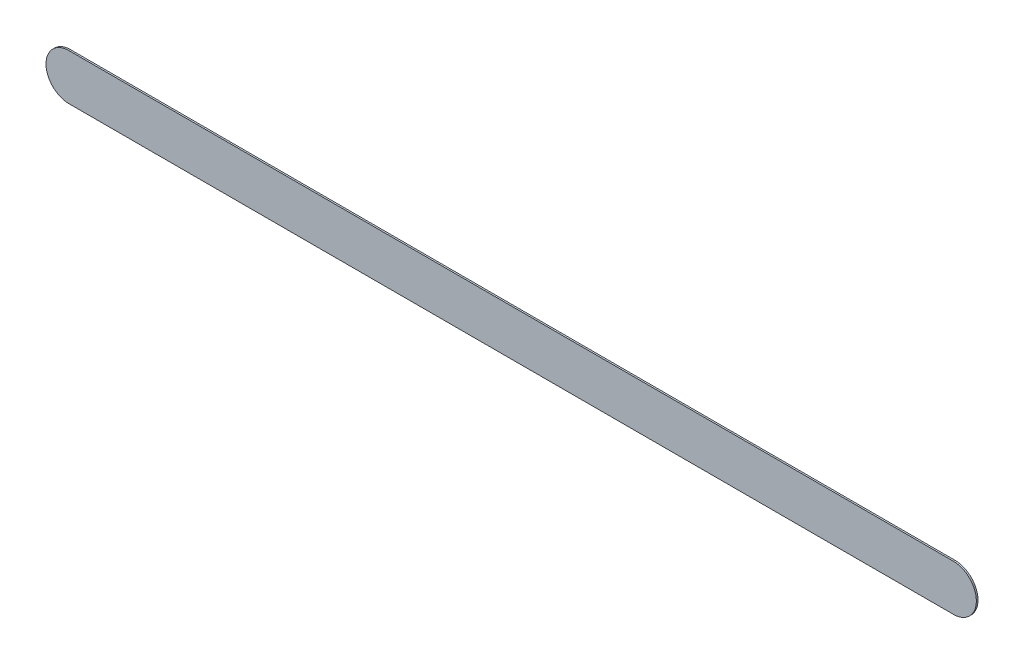
ISO-10303-21;
HEADER;
FILE_DESCRIPTION(('STEP AP214'),'2;1');
FILE_NAME('part.step','',(''),(''),'','','');
FILE_SCHEMA(('AUTOMOTIVE_DESIGN { 1 0 10303 214 1 1 1 1 }'));
ENDSEC;
DATA;
#1=APPLICATION_CONTEXT('core data for automotive mechanical design processes');
#2=APPLICATION_PROTOCOL_DEFINITION('international standard','automotive_design',2000,#1);
#3=PRODUCT_CONTEXT('',#1,'mechanical');
#4=PRODUCT('Part','Part','',(#3));
#5=PRODUCT_RELATED_PRODUCT_CATEGORY('part','',(#4));
#6=PRODUCT_DEFINITION_FORMATION('','',#4);
#7=PRODUCT_DEFINITION_CONTEXT('part definition',#1,'design');
#8=PRODUCT_DEFINITION('design','',#6,#7);
#9=PRODUCT_DEFINITION_SHAPE('','',#8);
#10=(LENGTH_UNIT() NAMED_UNIT(*) SI_UNIT(.MILLI.,.METRE.));
#11=(NAMED_UNIT(*) PLANE_ANGLE_UNIT() SI_UNIT($,.RADIAN.));
#12=(NAMED_UNIT(*) SI_UNIT($,.STERADIAN.) SOLID_ANGLE_UNIT());
#13=UNCERTAINTY_MEASURE_WITH_UNIT(LENGTH_MEASURE(1.E-05),#10,'distance_accuracy_value','');
#14=(GEOMETRIC_REPRESENTATION_CONTEXT(3) GLOBAL_UNCERTAINTY_ASSIGNED_CONTEXT((#13)) GLOBAL_UNIT_ASSIGNED_CONTEXT((#10,
#11,#12)) REPRESENTATION_CONTEXT('',''));
#15=CARTESIAN_POINT('',(0.,0.,0.));
#16=DIRECTION('',(0.,0.,1.));
#17=DIRECTION('',(1.,0.,0.));
#18=AXIS2_PLACEMENT_3D('',#15,#16,#17);
#19=CARTESIAN_POINT('',(91.2229824,48.903001,0.));
#20=DIRECTION('',(0.,1.,0.));
#21=DIRECTION('',(1.,0.,0.));
#22=AXIS2_PLACEMENT_3D('',#19,#20,#21);
#23=PLANE('',#22);
#24=DIRECTION('',(1.,0.,0.));
#25=VECTOR('',#24,1.);
#26=CARTESIAN_POINT('',(91.2229824,48.903001,0.03556));
#27=LINE('',#26,#25);
#28=CARTESIAN_POINT('',(91.2229824,48.903001,0.03556));
#29=VERTEX_POINT('',#28);
#30=CARTESIAN_POINT('',(110.4392,48.903001,0.03556));
#31=VERTEX_POINT('',#30);
#32=EDGE_CURVE('E11',#29,#31,#27,.T.);
#33=ORIENTED_EDGE('',*,*,#32,.F.);
#34=DIRECTION('',(0.,0.,1.));
#35=VECTOR('',#34,1.);
#36=CARTESIAN_POINT('',(91.2229824,48.903001,0.));
#37=LINE('',#36,#35);
#38=CARTESIAN_POINT('',(91.2229824,48.903001,0.));
#39=VERTEX_POINT('',#38);
#40=EDGE_CURVE('E24',#39,#29,#37,.T.);
#41=ORIENTED_EDGE('',*,*,#40,.F.);
#42=DIRECTION('',(1.,0.,0.));
#43=VECTOR('',#42,1.);
#44=CARTESIAN_POINT('',(91.2229824,48.903001,0.));
#45=LINE('',#44,#43);
#46=CARTESIAN_POINT('',(110.4392,48.903001,0.));
#47=VERTEX_POINT('',#46);
#48=EDGE_CURVE('E75',#39,#47,#45,.T.);
#49=ORIENTED_EDGE('',*,*,#48,.T.);
#50=DIRECTION('',(0.,0.,1.));
#51=VECTOR('',#50,1.);
#52=CARTESIAN_POINT('',(110.4392,48.903001,0.));
#53=LINE('',#52,#51);
#54=EDGE_CURVE('E37',#47,#31,#53,.T.);
#55=ORIENTED_EDGE('',*,*,#54,.T.);
#56=EDGE_LOOP('',(#33,#41,#49,#55));
#57=FACE_BOUND('',#56,.T.);
#58=ADVANCED_FACE('F17',(#57),#23,.F.);
#59=CARTESIAN_POINT('',(110.4392,49.403,0.));
#60=DIRECTION('',(0.,0.,-1.));
#61=DIRECTION('',(0.,-1.,0.));
#62=AXIS2_PLACEMENT_3D('',#59,#60,#61);
#63=CYLINDRICAL_SURFACE('',#62,0.499999000000002);
#64=CARTESIAN_POINT('',(110.4392,49.403,0.03556));
#65=DIRECTION('',(0.,0.,1.));
#66=DIRECTION('',(0.,-1.,0.));
#67=AXIS2_PLACEMENT_3D('',#64,#65,#66);
#68=CIRCLE('',#67,0.499999000000002);
#69=CARTESIAN_POINT('',(110.4392,49.902999,0.03556));
#70=VERTEX_POINT('',#69);
#71=EDGE_CURVE('E83',#31,#70,#68,.T.);
#72=ORIENTED_EDGE('',*,*,#71,.F.);
#73=ORIENTED_EDGE('',*,*,#54,.F.);
#74=CARTESIAN_POINT('',(110.4392,49.403,0.));
#75=DIRECTION('',(0.,0.,1.));
#76=DIRECTION('',(0.,-1.,0.));
#77=AXIS2_PLACEMENT_3D('',#74,#75,#76);
#78=CIRCLE('',#77,0.499999000000002);
#79=CARTESIAN_POINT('',(110.4392,49.902999,0.));
#80=VERTEX_POINT('',#79);
#81=EDGE_CURVE('E81',#47,#80,#78,.T.);
#82=ORIENTED_EDGE('',*,*,#81,.T.);
#83=DIRECTION('',(0.,0.,1.));
#84=VECTOR('',#83,1.);
#85=CARTESIAN_POINT('',(110.4392,49.902999,0.));
#86=LINE('',#85,#84);
#87=EDGE_CURVE('E67',#80,#70,#86,.T.);
#88=ORIENTED_EDGE('',*,*,#87,.T.);
#89=EDGE_LOOP('',(#72,#73,#82,#88));
#90=FACE_BOUND('',#89,.T.);
#91=ADVANCED_FACE('F89',(#90),#63,.T.);
#92=CARTESIAN_POINT('',(110.4392,49.902999,0.));
#93=DIRECTION('',(0.,-1.,0.));
#94=DIRECTION('',(-1.,0.,0.));
#95=AXIS2_PLACEMENT_3D('',#92,#93,#94);
#96=PLANE('',#95);
#97=DIRECTION('',(-1.,0.,0.));
#98=VECTOR('',#97,1.);
#99=CARTESIAN_POINT('',(110.4392,49.902999,0.03556));
#100=LINE('',#99,#98);
#101=CARTESIAN_POINT('',(91.2229824,49.902999,0.03556));
#102=VERTEX_POINT('',#101);
#103=EDGE_CURVE('E71',#70,#102,#100,.T.);
#104=ORIENTED_EDGE('',*,*,#103,.F.);
#105=ORIENTED_EDGE('',*,*,#87,.F.);
#106=DIRECTION('',(-1.,0.,0.));
#107=VECTOR('',#106,1.);
#108=CARTESIAN_POINT('',(110.4392,49.902999,0.));
#109=LINE('',#108,#107);
#110=CARTESIAN_POINT('',(91.2229824,49.902999,0.));
#111=VERTEX_POINT('',#110);
#112=EDGE_CURVE('E63',#80,#111,#109,.T.);
#113=ORIENTED_EDGE('',*,*,#112,.T.);
#114=DIRECTION('',(0.,0.,1.));
#115=VECTOR('',#114,1.);
#116=CARTESIAN_POINT('',(91.2229824,49.902999,0.));
#117=LINE('',#116,#115);
#118=EDGE_CURVE('E53',#111,#102,#117,.T.);
#119=ORIENTED_EDGE('',*,*,#118,.T.);
#120=EDGE_LOOP('',(#104,#105,#113,#119));
#121=FACE_BOUND('',#120,.T.);
#122=ADVANCED_FACE('F66',(#121),#96,.F.);
#123=CARTESIAN_POINT('',(91.2229824,49.403,0.));
#124=DIRECTION('',(0.,0.,-1.));
#125=DIRECTION('',(0.,1.,0.));
#126=AXIS2_PLACEMENT_3D('',#123,#124,#125);
#127=CYLINDRICAL_SURFACE('',#126,0.499999000000002);
#128=CARTESIAN_POINT('',(91.2229824,49.403,0.03556));
#129=DIRECTION('',(0.,0.,1.));
#130=DIRECTION('',(0.,1.,0.));
#131=AXIS2_PLACEMENT_3D('',#128,#129,#130);
#132=CIRCLE('',#131,0.499999000000002);
#133=EDGE_CURVE('E59',#102,#29,#132,.T.);
#134=ORIENTED_EDGE('',*,*,#133,.F.);
#135=ORIENTED_EDGE('',*,*,#118,.F.);
#136=CARTESIAN_POINT('',(91.2229824,49.403,0.));
#137=DIRECTION('',(0.,0.,1.));
#138=DIRECTION('',(0.,1.,0.));
#139=AXIS2_PLACEMENT_3D('',#136,#137,#138);
#140=CIRCLE('',#139,0.499999000000002);
#141=EDGE_CURVE('E57',#111,#39,#140,.T.);
#142=ORIENTED_EDGE('',*,*,#141,.T.);
#143=ORIENTED_EDGE('',*,*,#40,.T.);
#144=EDGE_LOOP('',(#134,#135,#142,#143));
#145=FACE_BOUND('',#144,.T.);
#146=ADVANCED_FACE('F55',(#145),#127,.T.);
#147=CARTESIAN_POINT('',(91.2229824,48.903001,0.));
#148=DIRECTION('',(0.,0.,-1.));
#149=DIRECTION('',(-1.,0.,0.));
#150=AXIS2_PLACEMENT_3D('',#147,#148,#149);
#151=PLANE('',#150);
#152=ORIENTED_EDGE('',*,*,#141,.F.);
#153=ORIENTED_EDGE('',*,*,#112,.F.);
#154=ORIENTED_EDGE('',*,*,#81,.F.);
#155=ORIENTED_EDGE('',*,*,#48,.F.);
#156=EDGE_LOOP('',(#152,#153,#154,#155));
#157=FACE_BOUND('',#156,.T.);
#158=ADVANCED_FACE('F74',(#157),#151,.T.);
#159=CARTESIAN_POINT('',(91.2229824,48.903001,0.03556));
#160=DIRECTION('',(0.,0.,-1.));
#161=DIRECTION('',(-1.,0.,0.));
#162=AXIS2_PLACEMENT_3D('',#159,#160,#161);
#163=PLANE('',#162);
#164=ORIENTED_EDGE('',*,*,#32,.T.);
#165=ORIENTED_EDGE('',*,*,#71,.T.);
#166=ORIENTED_EDGE('',*,*,#103,.T.);
#167=ORIENTED_EDGE('',*,*,#133,.T.);
#168=EDGE_LOOP('',(#164,#165,#166,#167));
#169=FACE_BOUND('',#168,.T.);
#170=ADVANCED_FACE('F91',(#169),#163,.F.);
#171=CLOSED_SHELL('',(#58,#91,#122,#146,#158,#170));
#172=MANIFOLD_SOLID_BREP('B1',#171);
#173=ADVANCED_BREP_SHAPE_REPRESENTATION('',(#18,#172),#14);
#174=SHAPE_DEFINITION_REPRESENTATION(#9,#173);
ENDSEC;
END-ISO-10303-21;
